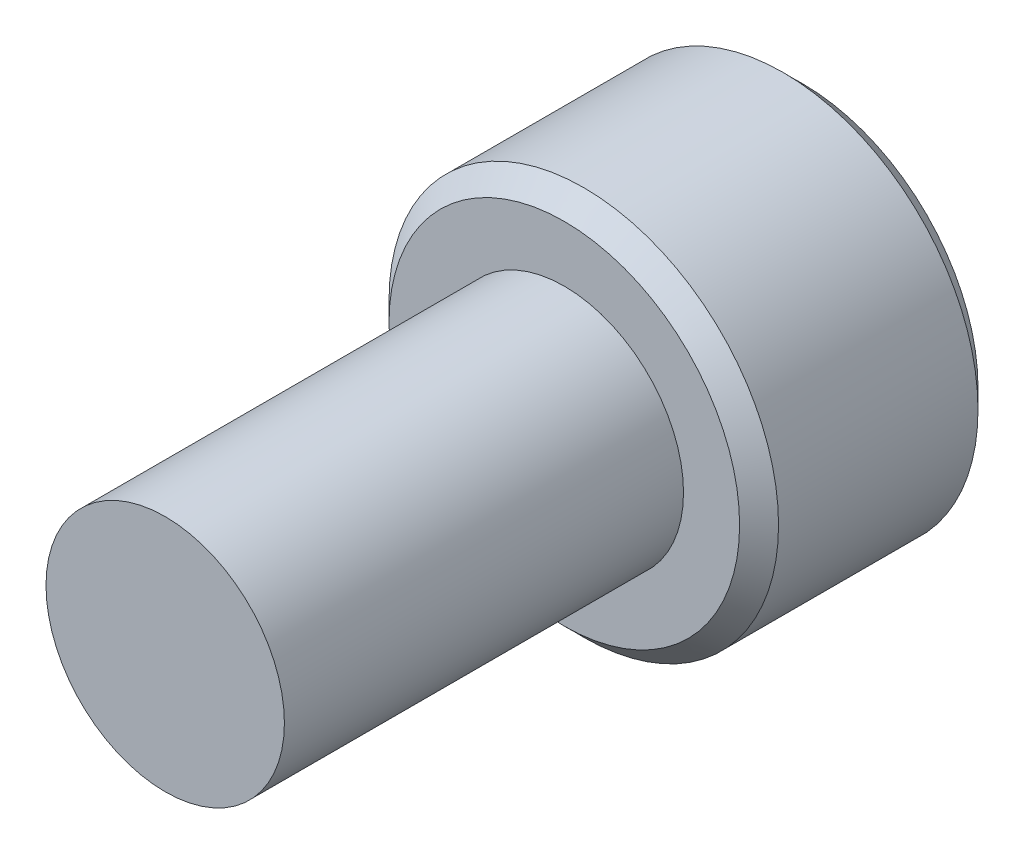
ISO-10303-21;
HEADER;
FILE_DESCRIPTION(('STEP AP214'),'2;1');
FILE_NAME('part.step','',(''),(''),'','','');
FILE_SCHEMA(('AUTOMOTIVE_DESIGN { 1 0 10303 214 1 1 1 1 }'));
ENDSEC;
DATA;
#1=APPLICATION_CONTEXT('core data for automotive mechanical design processes');
#2=APPLICATION_PROTOCOL_DEFINITION('international standard','automotive_design',2000,#1);
#3=PRODUCT_CONTEXT('',#1,'mechanical');
#4=PRODUCT('Part','Part','',(#3));
#5=PRODUCT_RELATED_PRODUCT_CATEGORY('part','',(#4));
#6=PRODUCT_DEFINITION_FORMATION('','',#4);
#7=PRODUCT_DEFINITION_CONTEXT('part definition',#1,'design');
#8=PRODUCT_DEFINITION('design','',#6,#7);
#9=PRODUCT_DEFINITION_SHAPE('','',#8);
#10=(LENGTH_UNIT() NAMED_UNIT(*) SI_UNIT(.MILLI.,.METRE.));
#11=(NAMED_UNIT(*) PLANE_ANGLE_UNIT() SI_UNIT($,.RADIAN.));
#12=(NAMED_UNIT(*) SI_UNIT($,.STERADIAN.) SOLID_ANGLE_UNIT());
#13=UNCERTAINTY_MEASURE_WITH_UNIT(LENGTH_MEASURE(1.E-05),#10,'distance_accuracy_value','');
#14=(GEOMETRIC_REPRESENTATION_CONTEXT(3) GLOBAL_UNCERTAINTY_ASSIGNED_CONTEXT((#13)) GLOBAL_UNIT_ASSIGNED_CONTEXT((#10,
#11,#12)) REPRESENTATION_CONTEXT('',''));
#15=CARTESIAN_POINT('',(0.,0.,0.));
#16=DIRECTION('',(0.,0.,1.));
#17=DIRECTION('',(1.,0.,0.));
#18=AXIS2_PLACEMENT_3D('',#15,#16,#17);
#19=CARTESIAN_POINT('',(0.,0.,-4.7625));
#20=DIRECTION('',(0.,0.,1.));
#21=DIRECTION('',(1.,0.,0.));
#22=AXIS2_PLACEMENT_3D('',#19,#20,#21);
#23=CYLINDRICAL_SURFACE('',#22,1.4224);
#24=CARTESIAN_POINT('',(0.,0.,-4.7625));
#25=DIRECTION('',(0.,0.,-1.));
#26=DIRECTION('',(-1.,0.,0.));
#27=AXIS2_PLACEMENT_3D('',#24,#25,#26);
#28=CIRCLE('',#27,1.4224);
#29=CARTESIAN_POINT('',(1.4224,0.,-4.7625));
#30=VERTEX_POINT('',#29);
#31=EDGE_CURVE('E203',#30,#30,#28,.F.);
#32=CARTESIAN_POINT('',(0.,0.,0.));
#33=DIRECTION('',(0.,0.,1.));
#34=DIRECTION('',(1.,0.,0.));
#35=AXIS2_PLACEMENT_3D('',#32,#33,#34);
#36=CIRCLE('',#35,1.4224);
#37=CARTESIAN_POINT('',(1.4224,0.,0.));
#38=VERTEX_POINT('',#37);
#39=EDGE_CURVE('E109',#38,#38,#36,.T.);
#40=CARTESIAN_POINT('',(1.4224,0.,-4.7625));
#41=CARTESIAN_POINT('',(1.4224,0.,-4.712890625));
#42=CARTESIAN_POINT('',(1.4224,0.,-4.66328125));
#43=CARTESIAN_POINT('',(1.4224,0.,-4.5640625));
#44=CARTESIAN_POINT('',(1.4224,0.,-4.514453125));
#45=CARTESIAN_POINT('',(1.4224,0.,-4.415234375));
#46=CARTESIAN_POINT('',(1.4224,0.,-4.365625));
#47=CARTESIAN_POINT('',(1.4224,0.,-4.26640625));
#48=CARTESIAN_POINT('',(1.4224,0.,-4.216796875));
#49=CARTESIAN_POINT('',(1.4224,0.,-4.117578125));
#50=CARTESIAN_POINT('',(1.4224,0.,-4.06796875));
#51=CARTESIAN_POINT('',(1.4224,0.,-3.96875));
#52=CARTESIAN_POINT('',(1.4224,0.,-3.919140625));
#53=CARTESIAN_POINT('',(1.4224,0.,-3.819921875));
#54=CARTESIAN_POINT('',(1.4224,0.,-3.7703125));
#55=CARTESIAN_POINT('',(1.4224,0.,-3.67109375));
#56=CARTESIAN_POINT('',(1.4224,0.,-3.621484375));
#57=CARTESIAN_POINT('',(1.4224,0.,-3.522265625));
#58=CARTESIAN_POINT('',(1.4224,0.,-3.47265625));
#59=CARTESIAN_POINT('',(1.4224,0.,-3.3734375));
#60=CARTESIAN_POINT('',(1.4224,0.,-3.323828125));
#61=CARTESIAN_POINT('',(1.4224,0.,-3.224609375));
#62=CARTESIAN_POINT('',(1.4224,0.,-3.175));
#63=CARTESIAN_POINT('',(1.4224,0.,-3.07578125));
#64=CARTESIAN_POINT('',(1.4224,0.,-3.026171875));
#65=CARTESIAN_POINT('',(1.4224,0.,-2.926953125));
#66=CARTESIAN_POINT('',(1.4224,0.,-2.87734375));
#67=CARTESIAN_POINT('',(1.4224,0.,-2.778125));
#68=CARTESIAN_POINT('',(1.4224,0.,-2.728515625));
#69=CARTESIAN_POINT('',(1.4224,0.,-2.629296875));
#70=CARTESIAN_POINT('',(1.4224,0.,-2.5796875));
#71=CARTESIAN_POINT('',(1.4224,0.,-2.48046875));
#72=CARTESIAN_POINT('',(1.4224,0.,-2.430859375));
#73=CARTESIAN_POINT('',(1.4224,0.,-2.331640625));
#74=CARTESIAN_POINT('',(1.4224,0.,-2.28203125));
#75=CARTESIAN_POINT('',(1.4224,0.,-2.1828125));
#76=CARTESIAN_POINT('',(1.4224,0.,-2.133203125));
#77=CARTESIAN_POINT('',(1.4224,0.,-2.033984375));
#78=CARTESIAN_POINT('',(1.4224,0.,-1.984375));
#79=CARTESIAN_POINT('',(1.4224,0.,-1.88515625));
#80=CARTESIAN_POINT('',(1.4224,0.,-1.835546875));
#81=CARTESIAN_POINT('',(1.4224,0.,-1.736328125));
#82=CARTESIAN_POINT('',(1.4224,0.,-1.68671875));
#83=CARTESIAN_POINT('',(1.4224,0.,-1.5875));
#84=CARTESIAN_POINT('',(1.4224,0.,-1.537890625));
#85=CARTESIAN_POINT('',(1.4224,0.,-1.438671875));
#86=CARTESIAN_POINT('',(1.4224,0.,-1.3890625));
#87=CARTESIAN_POINT('',(1.4224,0.,-1.28984375));
#88=CARTESIAN_POINT('',(1.4224,0.,-1.240234375));
#89=CARTESIAN_POINT('',(1.4224,0.,-1.141015625));
#90=CARTESIAN_POINT('',(1.4224,0.,-1.09140625));
#91=CARTESIAN_POINT('',(1.4224,0.,-0.992187499999999));
#92=CARTESIAN_POINT('',(1.4224,0.,-0.942578124999999));
#93=CARTESIAN_POINT('',(1.4224,0.,-0.843359375));
#94=CARTESIAN_POINT('',(1.4224,0.,-0.79375));
#95=CARTESIAN_POINT('',(1.4224,0.,-0.69453125));
#96=CARTESIAN_POINT('',(1.4224,0.,-0.644921875));
#97=CARTESIAN_POINT('',(1.4224,0.,-0.545703125));
#98=CARTESIAN_POINT('',(1.4224,0.,-0.49609375));
#99=CARTESIAN_POINT('',(1.4224,0.,-0.396875));
#100=CARTESIAN_POINT('',(1.4224,0.,-0.347265625));
#101=CARTESIAN_POINT('',(1.4224,0.,-0.248046875));
#102=CARTESIAN_POINT('',(1.4224,0.,-0.1984375));
#103=CARTESIAN_POINT('',(1.4224,0.,-0.09921875));
#104=CARTESIAN_POINT('',(1.4224,0.,-0.049609375));
#105=CARTESIAN_POINT('',(1.4224,0.,0.));
#106=B_SPLINE_CURVE_WITH_KNOTS('',3,(#40,#41,#42,#43,#44,#45,#46,#47,#48,#49,#50,#51,#52,#53,
#54,#55,#56,#57,#58,#59,#60,#61,#62,#63,#64,#65,#66,#67,#68,#69,#70,#71,#72,#73,#74,#75,#76,#77,
#78,#79,#80,#81,#82,#83,#84,#85,#86,#87,#88,#89,#90,#91,#92,#93,#94,#95,#96,#97,#98,#99,#100,
#101,#102,#103,#104,#105),.UNSPECIFIED.,.F.,.F.,(4,2,2,2,2,2,2,2,2,2,2,2,2,2,2,2,2,2,2,2,2,2,2,
2,2,2,2,2,2,2,2,2,4),(0.,0.148828125,0.29765625,0.446484375,0.5953125,0.744140625,
0.892968750000001,1.041796875,1.190625,1.339453125,1.48828125,1.637109375,1.7859375,1.934765625,
2.08359375,2.232421875,2.38125,2.530078125,2.67890625,2.827734375,2.9765625,3.125390625,
3.27421875,3.423046875,3.571875,3.720703125,3.86953125,4.018359375,4.1671875,4.316015625,
4.46484375,4.613671875,4.7625),.UNSPECIFIED.);
#107=EDGE_CURVE('BSEAM35',#30,#38,#106,.T.);
#108=ORIENTED_EDGE('',*,*,#31,.T.);
#109=ORIENTED_EDGE('',*,*,#39,.F.);
#110=ORIENTED_EDGE('',*,*,#107,.T.);
#111=ORIENTED_EDGE('',*,*,#107,.F.);
#112=EDGE_LOOP('',(#108,#110,#109,#111));
#113=FACE_BOUND('',#112,.T.);
#114=ADVANCED_FACE('F35',(#113),#23,.T.);
#115=CARTESIAN_POINT('',(0.,0.,0.));
#116=DIRECTION('',(0.,0.,1.));
#117=DIRECTION('',(1.,0.,0.));
#118=AXIS2_PLACEMENT_3D('',#115,#116,#117);
#119=PLANE('',#118);
#120=ORIENTED_EDGE('',*,*,#39,.T.);
#121=EDGE_LOOP('',(#120));
#122=FACE_BOUND('',#121,.T.);
#123=ADVANCED_FACE('F190',(#122),#119,.T.);
#124=CARTESIAN_POINT('',(0.,0.,-7.6073));
#125=DIRECTION('',(0.,0.,1.));
#126=DIRECTION('',(1.,0.,0.));
#127=AXIS2_PLACEMENT_3D('',#124,#125,#126);
#128=CYLINDRICAL_SURFACE('',#127,2.3241);
#129=CARTESIAN_POINT('',(0.,0.,-7.37489000000001));
#130=DIRECTION('',(0.,0.,-1.));
#131=DIRECTION('',(-1.,0.,0.));
#132=AXIS2_PLACEMENT_3D('',#129,#130,#131);
#133=CIRCLE('',#132,2.3241);
#134=CARTESIAN_POINT('',(-2.3241,0.,-7.37489000000001));
#135=VERTEX_POINT('',#134);
#136=EDGE_CURVE('E43',#135,#135,#133,.F.);
#137=ORIENTED_EDGE('',*,*,#136,.T.);
#138=EDGE_LOOP('',(#137));
#139=FACE_BOUND('',#138,.T.);
#140=CARTESIAN_POINT('',(0.,0.,-4.99491));
#141=DIRECTION('',(0.,0.,-1.));
#142=DIRECTION('',(-1.,0.,0.));
#143=AXIS2_PLACEMENT_3D('',#140,#141,#142);
#144=CIRCLE('',#143,2.3241);
#145=CARTESIAN_POINT('',(-2.3241,0.,-4.99491));
#146=VERTEX_POINT('',#145);
#147=EDGE_CURVE('E169',#146,#146,#144,.T.);
#148=ORIENTED_EDGE('',*,*,#147,.T.);
#149=EDGE_LOOP('',(#148));
#150=FACE_BOUND('',#149,.T.);
#151=ADVANCED_FACE('F174',(#139,#150),#128,.T.);
#152=CARTESIAN_POINT('',(0.,0.,-7.6073));
#153=DIRECTION('',(0.,0.,-1.));
#154=DIRECTION('',(-1.,0.,0.));
#155=AXIS2_PLACEMENT_3D('',#152,#153,#154);
#156=PLANE('',#155);
#157=CARTESIAN_POINT('',(0.,0.,-7.6073));
#158=DIRECTION('',(0.,0.,-1.));
#159=DIRECTION('',(-1.,0.,0.));
#160=AXIS2_PLACEMENT_3D('',#157,#158,#159);
#161=CIRCLE('',#160,2.09169);
#162=CARTESIAN_POINT('',(-2.09169,0.,-7.6073));
#163=VERTEX_POINT('',#162);
#164=EDGE_CURVE('E108',#163,#163,#161,.T.);
#165=ORIENTED_EDGE('',*,*,#164,.T.);
#166=EDGE_LOOP('',(#165));
#167=FACE_BOUND('',#166,.T.);
#168=CARTESIAN_POINT('',(0.,0.,-7.6073));
#169=DIRECTION('',(0.,0.,-1.));
#170=DIRECTION('',(-1.,0.,0.));
#171=AXIS2_PLACEMENT_3D('',#168,#169,#170);
#172=CIRCLE('',#171,1.3748153285078);
#173=CARTESIAN_POINT('',(-1.190625,0.687407664253897,-7.6073));
#174=VERTEX_POINT('',#173);
#175=CARTESIAN_POINT('',(0.,1.3748153285078,-7.6073));
#176=VERTEX_POINT('',#175);
#177=EDGE_CURVE('E89',#174,#176,#172,.T.);
#178=ORIENTED_EDGE('',*,*,#177,.F.);
#179=CARTESIAN_POINT('',(-1.190625,-0.687407664253898,-7.6073));
#180=VERTEX_POINT('',#179);
#181=EDGE_CURVE('E49',#180,#174,#172,.T.);
#182=ORIENTED_EDGE('',*,*,#181,.F.);
#183=CARTESIAN_POINT('',(0.,-1.3748153285078,-7.6073));
#184=VERTEX_POINT('',#183);
#185=EDGE_CURVE('E259',#184,#180,#172,.T.);
#186=ORIENTED_EDGE('',*,*,#185,.F.);
#187=CARTESIAN_POINT('',(1.190625,-0.687407664253898,-7.6073));
#188=VERTEX_POINT('',#187);
#189=EDGE_CURVE('E56',#188,#184,#172,.T.);
#190=ORIENTED_EDGE('',*,*,#189,.F.);
#191=CARTESIAN_POINT('',(1.190625,0.687407664253899,-7.6073));
#192=VERTEX_POINT('',#191);
#193=EDGE_CURVE('E130',#192,#188,#172,.T.);
#194=ORIENTED_EDGE('',*,*,#193,.F.);
#195=EDGE_CURVE('E98',#176,#192,#172,.T.);
#196=ORIENTED_EDGE('',*,*,#195,.F.);
#197=EDGE_LOOP('',(#178,#182,#186,#190,#194,#196));
#198=FACE_BOUND('',#197,.T.);
#199=ADVANCED_FACE('F129',(#167,#198),#156,.T.);
#200=CARTESIAN_POINT('',(0.,0.,-4.7625));
#201=DIRECTION('',(0.,0.,-1.));
#202=DIRECTION('',(-1.,0.,0.));
#203=AXIS2_PLACEMENT_3D('',#200,#201,#202);
#204=PLANE('',#203);
#205=CARTESIAN_POINT('',(0.,0.,-4.7625));
#206=DIRECTION('',(0.,0.,-1.));
#207=DIRECTION('',(-1.,0.,0.));
#208=AXIS2_PLACEMENT_3D('',#205,#206,#207);
#209=CIRCLE('',#208,2.09169);
#210=CARTESIAN_POINT('',(-2.09169,0.,-4.7625));
#211=VERTEX_POINT('',#210);
#212=EDGE_CURVE('E11',#211,#211,#209,.F.);
#213=ORIENTED_EDGE('',*,*,#212,.T.);
#214=EDGE_LOOP('',(#213));
#215=FACE_BOUND('',#214,.T.);
#216=ORIENTED_EDGE('',*,*,#31,.F.);
#217=EDGE_LOOP('',(#216));
#218=FACE_BOUND('',#217,.T.);
#219=ADVANCED_FACE('F183',(#215,#218),#204,.F.);
#220=CARTESIAN_POINT('',(0.,0.,-7.6073));
#221=DIRECTION('',(0.,0.,-1.));
#222=DIRECTION('',(-1.,0.,0.));
#223=AXIS2_PLACEMENT_3D('',#220,#221,#222);
#224=CONICAL_SURFACE('',#223,1.3748153285078,0.78539816339745);
#225=ORIENTED_EDGE('',*,*,#195,.T.);
#226=CARTESIAN_POINT('',(-0.000199999999999896,1.37493079856163,-7.60741548460003));
#227=CARTESIAN_POINT('',(0.0407344195898566,1.35129730039231,-7.58379876421427));
#228=CARTESIAN_POINT('',(0.0823533883019741,1.32726857760297,-7.56156878172312));
#229=CARTESIAN_POINT('',(0.167219443673633,1.27827113768908,-7.52086566262744));
#230=CARTESIAN_POINT('',(0.210474607290961,1.25329775733078,-7.50241518264755));
#231=CARTESIAN_POINT('',(0.297696647457424,1.2029400889614,-7.47080883800432));
#232=CARTESIAN_POINT('',(0.341641294957925,1.17756863489755,-7.45757350424332));
#233=CARTESIAN_POINT('',(0.430498374163694,1.12626697629869,-7.4371814515754));
#234=CARTESIAN_POINT('',(0.475408088834755,1.10033834044412,-7.43000950289599));
#235=CARTESIAN_POINT('',(0.552804127656978,1.0556537165959,-7.42353853864886));
#236=CARTESIAN_POINT('',(0.585190412515647,1.0369554863147,-7.42258032014679));
#237=CARTESIAN_POINT('',(0.64990607331777,0.99959188212981,-7.42419264907209));
#238=CARTESIAN_POINT('',(0.682235435127273,0.980926516386364,-7.42676397517958));
#239=CARTESIAN_POINT('',(0.746582156071485,0.943775919727753,-7.43528675399362));
#240=CARTESIAN_POINT('',(0.778599196336768,0.925290872911937,-7.44124135475257));
#241=CARTESIAN_POINT('',(0.842098763396457,0.888629380776601,-7.4562099640712));
#242=CARTESIAN_POINT('',(0.873581054644164,0.870453071450031,-7.46522528591206));
#243=CARTESIAN_POINT('',(0.954214838572127,0.823899134593444,-7.49198229583802));
#244=CARTESIAN_POINT('',(1.00285783526766,0.795815087357089,-7.51173681443601));
#245=CARTESIAN_POINT('',(1.09823941635212,0.740746505842243,-7.55623676895768));
#246=CARTESIAN_POINT('',(1.14498361758716,0.713758728676141,-7.58096596471616));
#247=CARTESIAN_POINT('',(1.190825,0.68729219420006,-7.60741548460003));
#248=B_SPLINE_CURVE_WITH_KNOTS('',3,(#226,#227,#228,#229,#230,#231,#232,#233,#234,#235,#236,
#237,#238,#239,#240,#241,#242,#243,#244,#245,#246,#247),.UNSPECIFIED.,.F.,.F.,(4,2,2,2,2,2,2,2,
2,2,4),(0.,0.15862567293412,0.318176079843271,0.475191357500655,0.631811068630748,
0.743878551794718,0.855970763007029,0.968167444423242,1.08041232768377,1.25873351645467,
1.43648174479847),.UNSPECIFIED.);
#249=EDGE_CURVE('E103',#176,#192,#248,.T.);
#250=ORIENTED_EDGE('',*,*,#249,.F.);
#251=EDGE_LOOP('',(#225,#250));
#252=FACE_BOUND('',#251,.T.);
#253=ADVANCED_FACE('F104',(#252),#224,.F.);
#254=ORIENTED_EDGE('',*,*,#193,.T.);
#255=CARTESIAN_POINT('',(1.190625,-1.37097145294693,-8.04829044728994));
#256=CARTESIAN_POINT('',(1.190625,-1.3375892063789,-8.02308998880783));
#257=CARTESIAN_POINT('',(1.190625,-1.30402095496658,-7.99813662023745));
#258=CARTESIAN_POINT('',(1.190625,-1.23643692297761,-7.94882608717721));
#259=CARTESIAN_POINT('',(1.190625,-1.20242103219112,-7.92446907389937));
#260=CARTESIAN_POINT('',(1.190625,-1.09909081482554,-7.85209820898922));
#261=CARTESIAN_POINT('',(1.190625,-1.02900143506767,-7.80517262259556));
#262=CARTESIAN_POINT('',(1.190625,-0.882026737424228,-7.71305210332563));
#263=CARTESIAN_POINT('',(1.190625,-0.80498186601998,-7.66810883724206));
#264=CARTESIAN_POINT('',(1.190625,-0.647043893307964,-7.58589802450687));
#265=CARTESIAN_POINT('',(1.190625,-0.56616494370292,-7.54860460173212));
#266=CARTESIAN_POINT('',(1.190625,-0.444764933868855,-7.5029795555631));
#267=CARTESIAN_POINT('',(1.190625,-0.406041211486713,-7.48988483902149));
#268=CARTESIAN_POINT('',(1.190625,-0.327658904711932,-7.46680427589664));
#269=CARTESIAN_POINT('',(1.190625,-0.288000256118251,-7.45681864348596));
#270=CARTESIAN_POINT('',(1.190625,-0.208647693212096,-7.44064122906525));
#271=CARTESIAN_POINT('',(1.190625,-0.168967240621961,-7.43438444584898));
#272=CARTESIAN_POINT('',(1.190625,-0.0891819742965323,-7.42578688841852));
#273=CARTESIAN_POINT('',(1.190625,-0.0490772347013114,-7.4234454410499));
#274=CARTESIAN_POINT('',(1.190625,0.0297075773931775,-7.42285224406765));
#275=CARTESIAN_POINT('',(1.190625,0.0683866068288096,-7.42445535379605));
#276=CARTESIAN_POINT('',(1.190625,0.145416876633151,-7.43134302774451));
#277=CARTESIAN_POINT('',(1.190625,0.183768052740679,-7.43662829766849));
#278=CARTESIAN_POINT('',(1.190625,0.260508634904945,-7.45068141223287));
#279=CARTESIAN_POINT('',(1.190625,0.298887052039133,-7.45950836260581));
#280=CARTESIAN_POINT('',(1.190625,0.374805334250664,-7.48017570998062));
#281=CARTESIAN_POINT('',(1.190625,0.412345269207094,-7.49201585483594));
#282=CARTESIAN_POINT('',(1.190625,0.53053558090884,-7.5337473336672));
#283=CARTESIAN_POINT('',(1.190625,0.609503725744447,-7.56839139691435));
#284=CARTESIAN_POINT('',(1.190625,0.763730269113467,-7.64541825197487));
#285=CARTESIAN_POINT('',(1.190625,0.838974064674606,-7.68782884666867));
#286=CARTESIAN_POINT('',(1.190625,0.982775796189619,-7.77532564502496));
#287=CARTESIAN_POINT('',(1.190625,1.05148016607044,-7.82017416205523));
#288=CARTESIAN_POINT('',(1.190625,1.15270222256254,-7.88950532992261));
#289=CARTESIAN_POINT('',(1.190625,1.18600604145834,-7.91286017633718));
#290=CARTESIAN_POINT('',(1.190625,1.25215860362232,-7.96018756901931));
#291=CARTESIAN_POINT('',(1.190625,1.28500746868279,-7.98415994485829));
#292=CARTESIAN_POINT('',(1.190625,1.31766689427974,-8.00838836677126));
#293=B_SPLINE_CURVE_WITH_KNOTS('',3,(#255,#256,#257,#258,#259,#260,#261,#262,#263,#264,#265,
#266,#267,#268,#269,#270,#271,#272,#273,#274,#275,#276,#277,#278,#279,#280,#281,#282,#283,#284,
#285,#286,#287,#288,#289,#290,#291,#292),.UNSPECIFIED.,.F.,.F.,(4,2,2,2,2,2,2,2,2,2,2,2,2,2,2,2,
2,2,4),(0.,0.12547564476333,0.250982782413967,0.503912518769174,0.771279184643223,
1.03772598255657,1.16025581644629,1.28279408906665,1.40312855503246,1.5234423300503,
1.63939577664877,1.75537145240477,1.87336894094838,1.99135655861152,2.24929724983449,
2.50818004711563,2.75419821472196,2.87622362118597,2.99821570388961),.UNSPECIFIED.);
#294=EDGE_CURVE('E97',#192,#188,#293,.F.);
#295=ORIENTED_EDGE('',*,*,#294,.F.);
#296=EDGE_LOOP('',(#254,#295));
#297=FACE_BOUND('',#296,.T.);
#298=ADVANCED_FACE('F265',(#297),#224,.F.);
#299=ORIENTED_EDGE('',*,*,#189,.T.);
#300=CARTESIAN_POINT('',(1.190825,-0.687292194200061,-7.60741548460003));
#301=CARTESIAN_POINT('',(1.14989058041014,-0.710925692369386,-7.58379876421427));
#302=CARTESIAN_POINT('',(1.10827161169803,-0.734954415158721,-7.56156878172312));
#303=CARTESIAN_POINT('',(1.02340555632637,-0.78395185507261,-7.52086566262744));
#304=CARTESIAN_POINT('',(0.980150392709039,-0.808925235430916,-7.50241518264755));
#305=CARTESIAN_POINT('',(0.892928352542576,-0.859282903800292,-7.47080883800432));
#306=CARTESIAN_POINT('',(0.848983705042075,-0.884654357864149,-7.45757350424332));
#307=CARTESIAN_POINT('',(0.760126625836306,-0.935956016463003,-7.4371814515754));
#308=CARTESIAN_POINT('',(0.715216911165245,-0.96188465231757,-7.43000950289599));
#309=CARTESIAN_POINT('',(0.637820872343022,-1.00656927616579,-7.42353853864886));
#310=CARTESIAN_POINT('',(0.605434587484353,-1.025267506447,-7.42258032014679));
#311=CARTESIAN_POINT('',(0.54071892668223,-1.06263111063189,-7.42419264907209));
#312=CARTESIAN_POINT('',(0.508389564872727,-1.08129647637533,-7.42676397517958));
#313=CARTESIAN_POINT('',(0.444042843928515,-1.11844707303394,-7.43528675399362));
#314=CARTESIAN_POINT('',(0.412025803663232,-1.13693211984976,-7.44124135475257));
#315=CARTESIAN_POINT('',(0.348526236603543,-1.17359361198509,-7.4562099640712));
#316=CARTESIAN_POINT('',(0.317043945355836,-1.19176992131166,-7.46522528591206));
#317=CARTESIAN_POINT('',(0.236410161427873,-1.23832385816825,-7.49198229583802));
#318=CARTESIAN_POINT('',(0.187767164732342,-1.26640790540461,-7.51173681443601));
#319=CARTESIAN_POINT('',(0.0923855836478812,-1.32147648691945,-7.55623676895768));
#320=CARTESIAN_POINT('',(0.0456413824128445,-1.34846426408555,-7.58096596471616));
#321=CARTESIAN_POINT('',(-0.000200000000000056,-1.37493079856163,-7.60741548460003));
#322=B_SPLINE_CURVE_WITH_KNOTS('',3,(#300,#301,#302,#303,#304,#305,#306,#307,#308,#309,#310,
#311,#312,#313,#314,#315,#316,#317,#318,#319,#320,#321),.UNSPECIFIED.,.F.,.F.,(4,2,2,2,2,2,2,2,
2,2,4),(0.,0.158625672934121,0.318176079843271,0.475191357500656,0.631811068630748,
0.743878551794718,0.855970763007029,0.968167444423241,1.08041232768377,1.25873351645467,
1.43648174479847),.UNSPECIFIED.);
#323=EDGE_CURVE('E139',#188,#184,#322,.T.);
#324=ORIENTED_EDGE('',*,*,#323,.F.);
#325=EDGE_LOOP('',(#299,#324));
#326=FACE_BOUND('',#325,.T.);
#327=ADVANCED_FACE('F262',(#326),#224,.F.);
#328=ORIENTED_EDGE('',*,*,#185,.T.);
#329=CARTESIAN_POINT('',(0.000199999999999938,-1.37493079856163,-7.60741548460003));
#330=CARTESIAN_POINT('',(-0.0407344195898564,-1.35129730039231,-7.58379876421427));
#331=CARTESIAN_POINT('',(-0.0823533883019738,-1.32726857760297,-7.56156878172312));
#332=CARTESIAN_POINT('',(-0.167219443673632,-1.27827113768909,-7.52086566262744));
#333=CARTESIAN_POINT('',(-0.21047460729096,-1.25329775733078,-7.50241518264755));
#334=CARTESIAN_POINT('',(-0.297696647457424,-1.2029400889614,-7.47080883800432));
#335=CARTESIAN_POINT('',(-0.341641294957925,-1.17756863489755,-7.45757350424332));
#336=CARTESIAN_POINT('',(-0.430498374163693,-1.12626697629869,-7.4371814515754));
#337=CARTESIAN_POINT('',(-0.475408088834755,-1.10033834044413,-7.43000950289599));
#338=CARTESIAN_POINT('',(-0.552804127656978,-1.0556537165959,-7.42353853864886));
#339=CARTESIAN_POINT('',(-0.585190412515646,-1.0369554863147,-7.42258032014679));
#340=CARTESIAN_POINT('',(-0.64990607331777,-0.99959188212981,-7.42419264907209));
#341=CARTESIAN_POINT('',(-0.682235435127272,-0.980926516386365,-7.42676397517958));
#342=CARTESIAN_POINT('',(-0.746582156071485,-0.943775919727754,-7.43528675399362));
#343=CARTESIAN_POINT('',(-0.778599196336768,-0.925290872911938,-7.44124135475257));
#344=CARTESIAN_POINT('',(-0.842098763396457,-0.888629380776601,-7.4562099640712));
#345=CARTESIAN_POINT('',(-0.873581054644164,-0.870453071450031,-7.46522528591206));
#346=CARTESIAN_POINT('',(-0.954214838572127,-0.823899134593444,-7.49198229583802));
#347=CARTESIAN_POINT('',(-1.00285783526766,-0.795815087357089,-7.51173681443601));
#348=CARTESIAN_POINT('',(-1.09823941635212,-0.740746505842243,-7.55623676895768));
#349=CARTESIAN_POINT('',(-1.14498361758716,-0.713758728676141,-7.58096596471616));
#350=CARTESIAN_POINT('',(-1.190825,-0.68729219420006,-7.60741548460003));
#351=B_SPLINE_CURVE_WITH_KNOTS('',3,(#329,#330,#331,#332,#333,#334,#335,#336,#337,#338,#339,
#340,#341,#342,#343,#344,#345,#346,#347,#348,#349,#350),.UNSPECIFIED.,.F.,.F.,(4,2,2,2,2,2,2,2,
2,2,4),(0.,0.15862567293412,0.318176079843271,0.475191357500655,0.631811068630748,
0.743878551794718,0.855970763007029,0.968167444423242,1.08041232768377,1.25873351645467,
1.43648174479847),.UNSPECIFIED.);
#352=EDGE_CURVE('E237',#184,#180,#351,.T.);
#353=ORIENTED_EDGE('',*,*,#352,.F.);
#354=EDGE_LOOP('',(#328,#353));
#355=FACE_BOUND('',#354,.T.);
#356=ADVANCED_FACE('F261',(#355),#224,.F.);
#357=ORIENTED_EDGE('',*,*,#181,.T.);
#358=CARTESIAN_POINT('',(-1.190625,-1.37097145294693,-8.04829044728994));
#359=CARTESIAN_POINT('',(-1.190625,-1.3375892063789,-8.02308998880783));
#360=CARTESIAN_POINT('',(-1.190625,-1.30402095496658,-7.99813662023745));
#361=CARTESIAN_POINT('',(-1.190625,-1.23643692297761,-7.94882608717721));
#362=CARTESIAN_POINT('',(-1.190625,-1.20242103219112,-7.92446907389937));
#363=CARTESIAN_POINT('',(-1.190625,-1.09909081482554,-7.85209820898922));
#364=CARTESIAN_POINT('',(-1.190625,-1.02900143506767,-7.80517262259556));
#365=CARTESIAN_POINT('',(-1.190625,-0.882026737424228,-7.71305210332564));
#366=CARTESIAN_POINT('',(-1.190625,-0.804981866019979,-7.66810883724206));
#367=CARTESIAN_POINT('',(-1.190625,-0.647043893307963,-7.58589802450687));
#368=CARTESIAN_POINT('',(-1.190625,-0.566164943702919,-7.54860460173212));
#369=CARTESIAN_POINT('',(-1.190625,-0.444764933868855,-7.5029795555631));
#370=CARTESIAN_POINT('',(-1.190625,-0.406041211486712,-7.48988483902149));
#371=CARTESIAN_POINT('',(-1.190625,-0.327658904711932,-7.46680427589664));
#372=CARTESIAN_POINT('',(-1.190625,-0.288000256118251,-7.45681864348596));
#373=CARTESIAN_POINT('',(-1.190625,-0.208647693212096,-7.44064122906526));
#374=CARTESIAN_POINT('',(-1.190625,-0.168967240621961,-7.43438444584898));
#375=CARTESIAN_POINT('',(-1.190625,-0.0891819742965325,-7.42578688841852));
#376=CARTESIAN_POINT('',(-1.190625,-0.0490772347013116,-7.4234454410499));
#377=CARTESIAN_POINT('',(-1.190625,0.0297075773931771,-7.42285224406766));
#378=CARTESIAN_POINT('',(-1.190625,0.0683866068288092,-7.42445535379605));
#379=CARTESIAN_POINT('',(-1.190625,0.145416876633151,-7.43134302774451));
#380=CARTESIAN_POINT('',(-1.190625,0.183768052740679,-7.43662829766849));
#381=CARTESIAN_POINT('',(-1.190625,0.260508634904944,-7.45068141223287));
#382=CARTESIAN_POINT('',(-1.190625,0.298887052039132,-7.45950836260581));
#383=CARTESIAN_POINT('',(-1.190625,0.374805334250664,-7.48017570998063));
#384=CARTESIAN_POINT('',(-1.190625,0.412345269207094,-7.49201585483594));
#385=CARTESIAN_POINT('',(-1.190625,0.53053558090884,-7.5337473336672));
#386=CARTESIAN_POINT('',(-1.190625,0.609503725744447,-7.56839139691435));
#387=CARTESIAN_POINT('',(-1.190625,0.763730269113466,-7.64541825197487));
#388=CARTESIAN_POINT('',(-1.190625,0.838974064674606,-7.68782884666867));
#389=CARTESIAN_POINT('',(-1.190625,0.982775796189619,-7.77532564502496));
#390=CARTESIAN_POINT('',(-1.190625,1.05148016607044,-7.82017416205523));
#391=CARTESIAN_POINT('',(-1.190625,1.15270222256253,-7.88950532992261));
#392=CARTESIAN_POINT('',(-1.190625,1.18600604145834,-7.91286017633718));
#393=CARTESIAN_POINT('',(-1.190625,1.25215860362232,-7.96018756901931));
#394=CARTESIAN_POINT('',(-1.190625,1.28500746868279,-7.98415994485828));
#395=CARTESIAN_POINT('',(-1.190625,1.31766689427973,-8.00838836677126));
#396=B_SPLINE_CURVE_WITH_KNOTS('',3,(#358,#359,#360,#361,#362,#363,#364,#365,#366,#367,#368,
#369,#370,#371,#372,#373,#374,#375,#376,#377,#378,#379,#380,#381,#382,#383,#384,#385,#386,#387,
#388,#389,#390,#391,#392,#393,#394,#395),.UNSPECIFIED.,.F.,.F.,(4,2,2,2,2,2,2,2,2,2,2,2,2,2,2,2,
2,2,4),(0.,0.12547564476333,0.250982782413968,0.503912518769173,0.771279184643224,
1.03772598255657,1.16025581644629,1.28279408906665,1.40312855503246,1.5234423300503,
1.63939577664877,1.75537145240477,1.87336894094838,1.99135655861152,2.24929724983449,
2.50818004711563,2.75419821472196,2.87622362118597,2.99821570388961),.UNSPECIFIED.);
#397=EDGE_CURVE('E119',#180,#174,#396,.T.);
#398=ORIENTED_EDGE('',*,*,#397,.F.);
#399=EDGE_LOOP('',(#357,#398));
#400=FACE_BOUND('',#399,.T.);
#401=ADVANCED_FACE('F274',(#400),#224,.F.);
#402=ORIENTED_EDGE('',*,*,#177,.T.);
#403=CARTESIAN_POINT('',(-1.190825,0.68729219420006,-7.60741548460003));
#404=CARTESIAN_POINT('',(-1.14989058041014,0.710925692369385,-7.58379876421427));
#405=CARTESIAN_POINT('',(-1.10827161169803,0.734954415158721,-7.56156878172312));
#406=CARTESIAN_POINT('',(-1.02340555632637,0.78395185507261,-7.52086566262744));
#407=CARTESIAN_POINT('',(-0.98015039270904,0.808925235430915,-7.50241518264755));
#408=CARTESIAN_POINT('',(-0.892928352542576,0.859282903800291,-7.47080883800432));
#409=CARTESIAN_POINT('',(-0.848983705042075,0.884654357864149,-7.45757350424332));
#410=CARTESIAN_POINT('',(-0.760126625836307,0.935956016463003,-7.4371814515754));
#411=CARTESIAN_POINT('',(-0.715216911165245,0.961884652317569,-7.43000950289599));
#412=CARTESIAN_POINT('',(-0.637820872343022,1.00656927616579,-7.42353853864886));
#413=CARTESIAN_POINT('',(-0.605434587484354,1.02526750644699,-7.42258032014679));
#414=CARTESIAN_POINT('',(-0.54071892668223,1.06263111063189,-7.42419264907209));
#415=CARTESIAN_POINT('',(-0.508389564872728,1.08129647637533,-7.42676397517958));
#416=CARTESIAN_POINT('',(-0.444042843928516,1.11844707303394,-7.43528675399362));
#417=CARTESIAN_POINT('',(-0.412025803663232,1.13693211984976,-7.44124135475257));
#418=CARTESIAN_POINT('',(-0.348526236603543,1.17359361198509,-7.4562099640712));
#419=CARTESIAN_POINT('',(-0.317043945355836,1.19176992131166,-7.46522528591206));
#420=CARTESIAN_POINT('',(-0.236410161427873,1.23832385816825,-7.49198229583802));
#421=CARTESIAN_POINT('',(-0.187767164732342,1.26640790540461,-7.51173681443601));
#422=CARTESIAN_POINT('',(-0.0923855836478814,1.32147648691945,-7.55623676895768));
#423=CARTESIAN_POINT('',(-0.0456413824128448,1.34846426408555,-7.58096596471616));
#424=CARTESIAN_POINT('',(0.000199999999999905,1.37493079856163,-7.60741548460003));
#425=B_SPLINE_CURVE_WITH_KNOTS('',3,(#403,#404,#405,#406,#407,#408,#409,#410,#411,#412,#413,
#414,#415,#416,#417,#418,#419,#420,#421,#422,#423,#424),.UNSPECIFIED.,.F.,.F.,(4,2,2,2,2,2,2,2,
2,2,4),(0.,0.15862567293412,0.318176079843271,0.475191357500656,0.631811068630749,
0.743878551794718,0.855970763007029,0.968167444423242,1.08041232768377,1.25873351645467,
1.43648174479847),.UNSPECIFIED.);
#426=EDGE_CURVE('E93',#174,#176,#425,.T.);
#427=ORIENTED_EDGE('',*,*,#426,.F.);
#428=EDGE_LOOP('',(#402,#427));
#429=FACE_BOUND('',#428,.T.);
#430=ADVANCED_FACE('F91',(#429),#224,.F.);
#431=CARTESIAN_POINT('',(1.190625,2.06222299276169,-5.8213625));
#432=DIRECTION('',(0.,0.,-1.));
#433=DIRECTION('',(-1.,0.,0.));
#434=AXIS2_PLACEMENT_3D('',#431,#432,#433);
#435=PLANE('',#434);
#436=DIRECTION('',(0.866025403784439,0.5,0.));
#437=VECTOR('',#436,1.);
#438=CARTESIAN_POINT('',(-1.190625,0.687407664253898,-5.8213625));
#439=LINE('',#438,#437);
#440=CARTESIAN_POINT('',(-1.190625,0.687407664253898,-5.8213625));
#441=VERTEX_POINT('',#440);
#442=CARTESIAN_POINT('',(0.,1.3748153285078,-5.8213625));
#443=VERTEX_POINT('',#442);
#444=EDGE_CURVE('E118',#441,#443,#439,.T.);
#445=ORIENTED_EDGE('',*,*,#444,.T.);
#446=DIRECTION('',(0.866025403784439,-0.5,0.));
#447=VECTOR('',#446,1.);
#448=CARTESIAN_POINT('',(0.,1.3748153285078,-5.8213625));
#449=LINE('',#448,#447);
#450=CARTESIAN_POINT('',(1.190625,0.687407664253898,-5.8213625));
#451=VERTEX_POINT('',#450);
#452=EDGE_CURVE('E123',#443,#451,#449,.T.);
#453=ORIENTED_EDGE('',*,*,#452,.T.);
#454=DIRECTION('',(0.,-1.,0.));
#455=VECTOR('',#454,1.);
#456=CARTESIAN_POINT('',(1.190625,0.687407664253898,-5.8213625));
#457=LINE('',#456,#455);
#458=CARTESIAN_POINT('',(1.190625,-0.687407664253899,-5.8213625));
#459=VERTEX_POINT('',#458);
#460=EDGE_CURVE('E225',#451,#459,#457,.T.);
#461=ORIENTED_EDGE('',*,*,#460,.T.);
#462=DIRECTION('',(-0.866025403784439,-0.5,0.));
#463=VECTOR('',#462,1.);
#464=CARTESIAN_POINT('',(1.190625,-0.687407664253899,-5.8213625));
#465=LINE('',#464,#463);
#466=CARTESIAN_POINT('',(0.,-1.3748153285078,-5.8213625));
#467=VERTEX_POINT('',#466);
#468=EDGE_CURVE('E222',#459,#467,#465,.T.);
#469=ORIENTED_EDGE('',*,*,#468,.T.);
#470=DIRECTION('',(-0.866025403784439,0.5,0.));
#471=VECTOR('',#470,1.);
#472=CARTESIAN_POINT('',(0.,-1.3748153285078,-5.8213625));
#473=LINE('',#472,#471);
#474=CARTESIAN_POINT('',(-1.190625,-0.687407664253898,-5.8213625));
#475=VERTEX_POINT('',#474);
#476=EDGE_CURVE('E219',#467,#475,#473,.T.);
#477=ORIENTED_EDGE('',*,*,#476,.T.);
#478=DIRECTION('',(0.,1.,0.));
#479=VECTOR('',#478,1.);
#480=CARTESIAN_POINT('',(-1.190625,-0.687407664253898,-5.8213625));
#481=LINE('',#480,#479);
#482=EDGE_CURVE('E126',#475,#441,#481,.T.);
#483=ORIENTED_EDGE('',*,*,#482,.T.);
#484=EDGE_LOOP('',(#445,#453,#461,#469,#477,#483));
#485=FACE_BOUND('',#484,.T.);
#486=ADVANCED_FACE('F158',(#485),#435,.T.);
#487=CARTESIAN_POINT('',(0.,1.3748153285078,-5.8213625));
#488=DIRECTION('',(0.5,0.866025403784439,0.));
#489=DIRECTION('',(-0.866025403784439,0.5,0.));
#490=AXIS2_PLACEMENT_3D('',#487,#488,#489);
#491=PLANE('',#490);
#492=DIRECTION('',(0.,0.,-1.));
#493=VECTOR('',#492,1.);
#494=CARTESIAN_POINT('',(0.,1.3748153285078,-5.8213625));
#495=LINE('',#494,#493);
#496=EDGE_CURVE('E115',#443,#176,#495,.T.);
#497=ORIENTED_EDGE('',*,*,#496,.T.);
#498=ORIENTED_EDGE('',*,*,#249,.T.);
#499=DIRECTION('',(0.,0.,-1.));
#500=VECTOR('',#499,1.);
#501=CARTESIAN_POINT('',(1.190625,0.687407664253898,-5.8213625));
#502=LINE('',#501,#500);
#503=EDGE_CURVE('E125',#451,#192,#502,.T.);
#504=ORIENTED_EDGE('',*,*,#503,.F.);
#505=ORIENTED_EDGE('',*,*,#452,.F.);
#506=EDGE_LOOP('',(#497,#498,#504,#505));
#507=FACE_BOUND('',#506,.T.);
#508=ADVANCED_FACE('F121',(#507),#491,.F.);
#509=CARTESIAN_POINT('',(1.190625,0.687407664253898,-5.8213625));
#510=DIRECTION('',(1.,0.,0.));
#511=DIRECTION('',(0.,0.,-1.));
#512=AXIS2_PLACEMENT_3D('',#509,#510,#511);
#513=PLANE('',#512);
#514=ORIENTED_EDGE('',*,*,#503,.T.);
#515=ORIENTED_EDGE('',*,*,#294,.T.);
#516=DIRECTION('',(0.,0.,-1.));
#517=VECTOR('',#516,1.);
#518=CARTESIAN_POINT('',(1.190625,-0.687407664253899,-5.8213625));
#519=LINE('',#518,#517);
#520=EDGE_CURVE('E210',#459,#188,#519,.T.);
#521=ORIENTED_EDGE('',*,*,#520,.F.);
#522=ORIENTED_EDGE('',*,*,#460,.F.);
#523=EDGE_LOOP('',(#514,#515,#521,#522));
#524=FACE_BOUND('',#523,.T.);
#525=ADVANCED_FACE('F147',(#524),#513,.F.);
#526=CARTESIAN_POINT('',(1.190625,-0.687407664253899,-5.8213625));
#527=DIRECTION('',(0.5,-0.866025403784439,0.));
#528=DIRECTION('',(0.866025403784439,0.5,0.));
#529=AXIS2_PLACEMENT_3D('',#526,#527,#528);
#530=PLANE('',#529);
#531=ORIENTED_EDGE('',*,*,#520,.T.);
#532=ORIENTED_EDGE('',*,*,#323,.T.);
#533=DIRECTION('',(0.,0.,-1.));
#534=VECTOR('',#533,1.);
#535=CARTESIAN_POINT('',(0.,-1.3748153285078,-5.8213625));
#536=LINE('',#535,#534);
#537=EDGE_CURVE('E213',#467,#184,#536,.T.);
#538=ORIENTED_EDGE('',*,*,#537,.F.);
#539=ORIENTED_EDGE('',*,*,#468,.F.);
#540=EDGE_LOOP('',(#531,#532,#538,#539));
#541=FACE_BOUND('',#540,.T.);
#542=ADVANCED_FACE('F151',(#541),#530,.F.);
#543=CARTESIAN_POINT('',(0.,-1.3748153285078,-5.8213625));
#544=DIRECTION('',(-0.5,-0.866025403784439,0.));
#545=DIRECTION('',(0.866025403784439,-0.5,0.));
#546=AXIS2_PLACEMENT_3D('',#543,#544,#545);
#547=PLANE('',#546);
#548=ORIENTED_EDGE('',*,*,#537,.T.);
#549=ORIENTED_EDGE('',*,*,#352,.T.);
#550=DIRECTION('',(0.,0.,-1.));
#551=VECTOR('',#550,1.);
#552=CARTESIAN_POINT('',(-1.190625,-0.687407664253898,-5.8213625));
#553=LINE('',#552,#551);
#554=EDGE_CURVE('E206',#475,#180,#553,.T.);
#555=ORIENTED_EDGE('',*,*,#554,.F.);
#556=ORIENTED_EDGE('',*,*,#476,.F.);
#557=EDGE_LOOP('',(#548,#549,#555,#556));
#558=FACE_BOUND('',#557,.T.);
#559=ADVANCED_FACE('F244',(#558),#547,.F.);
#560=CARTESIAN_POINT('',(-1.190625,-0.687407664253898,-5.8213625));
#561=DIRECTION('',(-1.,0.,0.));
#562=DIRECTION('',(0.,0.,1.));
#563=AXIS2_PLACEMENT_3D('',#560,#561,#562);
#564=PLANE('',#563);
#565=ORIENTED_EDGE('',*,*,#554,.T.);
#566=ORIENTED_EDGE('',*,*,#397,.T.);
#567=DIRECTION('',(0.,0.,-1.));
#568=VECTOR('',#567,1.);
#569=CARTESIAN_POINT('',(-1.190625,0.687407664253898,-5.8213625));
#570=LINE('',#569,#568);
#571=EDGE_CURVE('E117',#441,#174,#570,.T.);
#572=ORIENTED_EDGE('',*,*,#571,.F.);
#573=ORIENTED_EDGE('',*,*,#482,.F.);
#574=EDGE_LOOP('',(#565,#566,#572,#573));
#575=FACE_BOUND('',#574,.T.);
#576=ADVANCED_FACE('F241',(#575),#564,.F.);
#577=CARTESIAN_POINT('',(-1.190625,0.687407664253898,-5.8213625));
#578=DIRECTION('',(-0.5,0.866025403784439,0.));
#579=DIRECTION('',(-0.866025403784439,-0.5,0.));
#580=AXIS2_PLACEMENT_3D('',#577,#578,#579);
#581=PLANE('',#580);
#582=ORIENTED_EDGE('',*,*,#571,.T.);
#583=ORIENTED_EDGE('',*,*,#426,.T.);
#584=ORIENTED_EDGE('',*,*,#496,.F.);
#585=ORIENTED_EDGE('',*,*,#444,.F.);
#586=EDGE_LOOP('',(#582,#583,#584,#585));
#587=FACE_BOUND('',#586,.T.);
#588=ADVANCED_FACE('F113',(#587),#581,.F.);
#589=CARTESIAN_POINT('',(0.,0.,-7.6073));
#590=DIRECTION('',(0.,0.,1.));
#591=DIRECTION('',(1.,0.,0.));
#592=AXIS2_PLACEMENT_3D('',#589,#590,#591);
#593=CONICAL_SURFACE('',#592,2.09169,0.785398163397453);
#594=ORIENTED_EDGE('',*,*,#136,.F.);
#595=EDGE_LOOP('',(#594));
#596=FACE_BOUND('',#595,.T.);
#597=ORIENTED_EDGE('',*,*,#164,.F.);
#598=EDGE_LOOP('',(#597));
#599=FACE_BOUND('',#598,.T.);
#600=ADVANCED_FACE('F177',(#596,#599),#593,.T.);
#601=CARTESIAN_POINT('',(0.,0.,-4.99491));
#602=DIRECTION('',(0.,0.,-1.));
#603=DIRECTION('',(-1.,0.,0.));
#604=AXIS2_PLACEMENT_3D('',#601,#602,#603);
#605=CONICAL_SURFACE('',#604,2.3241,0.785398163397451);
#606=ORIENTED_EDGE('',*,*,#212,.F.);
#607=EDGE_LOOP('',(#606));
#608=FACE_BOUND('',#607,.T.);
#609=ORIENTED_EDGE('',*,*,#147,.F.);
#610=EDGE_LOOP('',(#609));
#611=FACE_BOUND('',#610,.T.);
#612=ADVANCED_FACE('F37',(#608,#611),#605,.T.);
#613=CLOSED_SHELL('',(#114,#123,#151,#199,#219,#253,#298,#327,#356,#401,#430,#486,#508,#525,
#542,#559,#576,#588,#600,#612));
#614=MANIFOLD_SOLID_BREP('B2',#613);
#615=ADVANCED_BREP_SHAPE_REPRESENTATION('',(#18,#614),#14);
#616=SHAPE_DEFINITION_REPRESENTATION(#9,#615);
ENDSEC;
END-ISO-10303-21;
